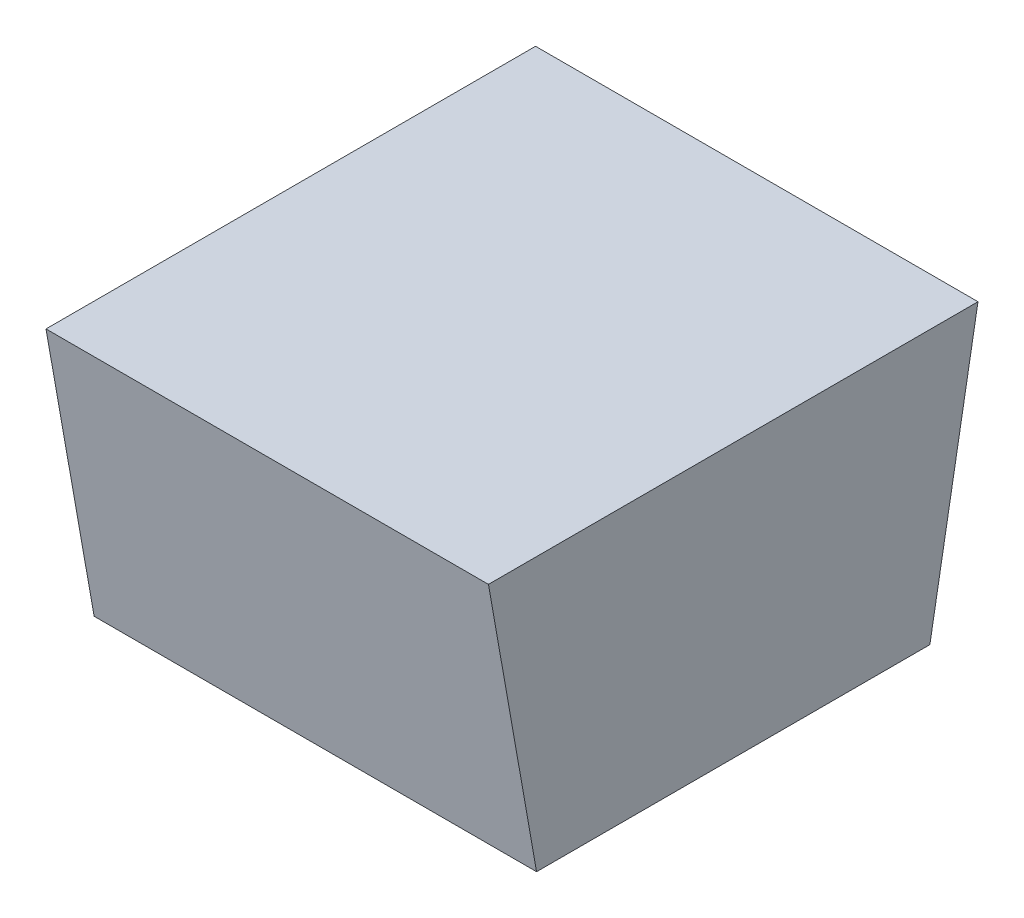
ISO-10303-21;
HEADER;
FILE_DESCRIPTION(('STEP AP214'),'2;1');
FILE_NAME('part.step','',(''),(''),'','','');
FILE_SCHEMA(('AUTOMOTIVE_DESIGN { 1 0 10303 214 1 1 1 1 }'));
ENDSEC;
DATA;
#1=APPLICATION_CONTEXT('core data for automotive mechanical design processes');
#2=APPLICATION_PROTOCOL_DEFINITION('international standard','automotive_design',2000,#1);
#3=PRODUCT_CONTEXT('',#1,'mechanical');
#4=PRODUCT('Part','Part','',(#3));
#5=PRODUCT_RELATED_PRODUCT_CATEGORY('part','',(#4));
#6=PRODUCT_DEFINITION_FORMATION('','',#4);
#7=PRODUCT_DEFINITION_CONTEXT('part definition',#1,'design');
#8=PRODUCT_DEFINITION('design','',#6,#7);
#9=PRODUCT_DEFINITION_SHAPE('','',#8);
#10=(LENGTH_UNIT() NAMED_UNIT(*) SI_UNIT(.MILLI.,.METRE.));
#11=(NAMED_UNIT(*) PLANE_ANGLE_UNIT() SI_UNIT($,.RADIAN.));
#12=(NAMED_UNIT(*) SI_UNIT($,.STERADIAN.) SOLID_ANGLE_UNIT());
#13=UNCERTAINTY_MEASURE_WITH_UNIT(LENGTH_MEASURE(1.E-05),#10,'distance_accuracy_value','');
#14=(GEOMETRIC_REPRESENTATION_CONTEXT(3) GLOBAL_UNCERTAINTY_ASSIGNED_CONTEXT((#13)) GLOBAL_UNIT_ASSIGNED_CONTEXT((#10,
#11,#12)) REPRESENTATION_CONTEXT('',''));
#15=CARTESIAN_POINT('',(0.,0.,0.));
#16=DIRECTION('',(0.,0.,1.));
#17=DIRECTION('',(1.,0.,0.));
#18=AXIS2_PLACEMENT_3D('',#15,#16,#17);
#19=CARTESIAN_POINT('',(0.,0.277595628415304,0.));
#20=DIRECTION('',(0.,1.,0.));
#21=DIRECTION('',(0.,0.,1.));
#22=AXIS2_PLACEMENT_3D('',#19,#20,#21);
#23=PLANE('',#22);
#24=DIRECTION('',(0.,0.,-1.));
#25=VECTOR('',#24,1.);
#26=CARTESIAN_POINT('',(-0.225000058,0.277595628415304,1.007000018));
#27=LINE('',#26,#25);
#28=CARTESIAN_POINT('',(-0.225000058,0.277595628415304,0.24894758001634));
#29=VERTEX_POINT('',#28);
#30=CARTESIAN_POINT('',(-0.225000058,0.277595628415304,-0.24894758001634));
#31=VERTEX_POINT('',#30);
#32=EDGE_CURVE('E92',#29,#31,#27,.T.);
#33=ORIENTED_EDGE('',*,*,#32,.F.);
#34=DIRECTION('',(-1.,0.,0.));
#35=VECTOR('',#34,1.);
#36=CARTESIAN_POINT('',(1.007000018,0.277595628415304,0.24894758001634));
#37=LINE('',#36,#35);
#38=CARTESIAN_POINT('',(0.225000058,0.277595628415304,0.24894758001634));
#39=VERTEX_POINT('',#38);
#40=EDGE_CURVE('E57',#39,#29,#37,.T.);
#41=ORIENTED_EDGE('',*,*,#40,.F.);
#42=DIRECTION('',(0.,0.,1.));
#43=VECTOR('',#42,1.);
#44=CARTESIAN_POINT('',(0.225000058,0.277595628415304,1.007000018));
#45=LINE('',#44,#43);
#46=CARTESIAN_POINT('',(0.225000058,0.277595628415304,-0.24894758001634));
#47=VERTEX_POINT('',#46);
#48=EDGE_CURVE('E12',#47,#39,#45,.T.);
#49=ORIENTED_EDGE('',*,*,#48,.F.);
#50=DIRECTION('',(1.,0.,0.));
#51=VECTOR('',#50,1.);
#52=CARTESIAN_POINT('',(1.007000018,0.277595628415304,-0.24894758001634));
#53=LINE('',#52,#51);
#54=EDGE_CURVE('E81',#31,#47,#53,.T.);
#55=ORIENTED_EDGE('',*,*,#54,.F.);
#56=EDGE_LOOP('',(#33,#41,#49,#55));
#57=FACE_BOUND('',#56,.T.);
#58=ADVANCED_FACE('F42',(#57),#23,.T.);
#59=CARTESIAN_POINT('',(1.007000018,0.,-0.199999981));
#60=DIRECTION('',(0.,-0.173648177666931,-0.984807753012208));
#61=DIRECTION('',(0.,0.984807753012208,-0.173648177666931));
#62=AXIS2_PLACEMENT_3D('',#59,#60,#61);
#63=PLANE('',#62);
#64=DIRECTION('',(0.,0.984807753012208,-0.173648177666931));
#65=VECTOR('',#64,1.);
#66=CARTESIAN_POINT('',(-0.225000058,0.,-0.199999981));
#67=LINE('',#66,#65);
#68=CARTESIAN_POINT('',(-0.225000058,0.,-0.199999981));
#69=VERTEX_POINT('',#68);
#70=EDGE_CURVE('E91',#69,#31,#67,.T.);
#71=ORIENTED_EDGE('',*,*,#70,.T.);
#72=ORIENTED_EDGE('',*,*,#54,.T.);
#73=DIRECTION('',(0.,-0.984807753012208,0.173648177666931));
#74=VECTOR('',#73,1.);
#75=CARTESIAN_POINT('',(0.225000058,0.,-0.199999981));
#76=LINE('',#75,#74);
#77=CARTESIAN_POINT('',(0.225000058,0.,-0.199999981));
#78=VERTEX_POINT('',#77);
#79=EDGE_CURVE('E88',#47,#78,#76,.T.);
#80=ORIENTED_EDGE('',*,*,#79,.T.);
#81=DIRECTION('',(-1.,0.,0.));
#82=VECTOR('',#81,1.);
#83=CARTESIAN_POINT('',(1.007000018,0.,-0.199999981));
#84=LINE('',#83,#82);
#85=EDGE_CURVE('E107',#78,#69,#84,.T.);
#86=ORIENTED_EDGE('',*,*,#85,.T.);
#87=EDGE_LOOP('',(#71,#72,#80,#86));
#88=FACE_BOUND('',#87,.T.);
#89=ADVANCED_FACE('F87',(#88),#63,.T.);
#90=CARTESIAN_POINT('',(1.007000018,0.,0.199999981));
#91=DIRECTION('',(0.,-0.173648177666931,0.984807753012208));
#92=DIRECTION('',(0.,-0.984807753012208,-0.173648177666931));
#93=AXIS2_PLACEMENT_3D('',#90,#91,#92);
#94=PLANE('',#93);
#95=DIRECTION('',(0.,0.984807753012208,0.173648177666931));
#96=VECTOR('',#95,1.);
#97=CARTESIAN_POINT('',(0.225000058,0.,0.199999981));
#98=LINE('',#97,#96);
#99=CARTESIAN_POINT('',(0.225000058,0.,0.199999981));
#100=VERTEX_POINT('',#99);
#101=EDGE_CURVE('E98',#100,#39,#98,.T.);
#102=ORIENTED_EDGE('',*,*,#101,.T.);
#103=ORIENTED_EDGE('',*,*,#40,.T.);
#104=DIRECTION('',(0.,-0.984807753012208,-0.173648177666931));
#105=VECTOR('',#104,1.);
#106=CARTESIAN_POINT('',(-0.225000058,0.,0.199999981));
#107=LINE('',#106,#105);
#108=CARTESIAN_POINT('',(-0.225000058,0.,0.199999981));
#109=VERTEX_POINT('',#108);
#110=EDGE_CURVE('E109',#29,#109,#107,.T.);
#111=ORIENTED_EDGE('',*,*,#110,.T.);
#112=DIRECTION('',(-1.,0.,0.));
#113=VECTOR('',#112,1.);
#114=CARTESIAN_POINT('',(1.007000018,0.,0.199999981));
#115=LINE('',#114,#113);
#116=EDGE_CURVE('E64',#100,#109,#115,.T.);
#117=ORIENTED_EDGE('',*,*,#116,.F.);
#118=EDGE_LOOP('',(#102,#103,#111,#117));
#119=FACE_BOUND('',#118,.T.);
#120=ADVANCED_FACE('F116',(#119),#94,.T.);
#121=CARTESIAN_POINT('',(-0.225000058,0.980000072,1.007000018));
#122=DIRECTION('',(-1.,0.,0.));
#123=DIRECTION('',(0.,-1.,0.));
#124=AXIS2_PLACEMENT_3D('',#121,#122,#123);
#125=PLANE('',#124);
#126=ORIENTED_EDGE('',*,*,#110,.F.);
#127=ORIENTED_EDGE('',*,*,#32,.T.);
#128=ORIENTED_EDGE('',*,*,#70,.F.);
#129=DIRECTION('',(0.,0.,-1.));
#130=VECTOR('',#129,1.);
#131=CARTESIAN_POINT('',(-0.225000058,0.,0.199999981));
#132=LINE('',#131,#130);
#133=EDGE_CURVE('E97',#109,#69,#132,.T.);
#134=ORIENTED_EDGE('',*,*,#133,.F.);
#135=EDGE_LOOP('',(#126,#127,#128,#134));
#136=FACE_BOUND('',#135,.T.);
#137=ADVANCED_FACE('F114',(#136),#125,.T.);
#138=CARTESIAN_POINT('',(0.225000058,-0.00999998,1.007000018));
#139=DIRECTION('',(1.,0.,0.));
#140=DIRECTION('',(0.,1.,0.));
#141=AXIS2_PLACEMENT_3D('',#138,#139,#140);
#142=PLANE('',#141);
#143=ORIENTED_EDGE('',*,*,#79,.F.);
#144=ORIENTED_EDGE('',*,*,#48,.T.);
#145=ORIENTED_EDGE('',*,*,#101,.F.);
#146=DIRECTION('',(0.,0.,1.));
#147=VECTOR('',#146,1.);
#148=CARTESIAN_POINT('',(0.225000058,0.,0.199999981));
#149=LINE('',#148,#147);
#150=EDGE_CURVE('E50',#78,#100,#149,.T.);
#151=ORIENTED_EDGE('',*,*,#150,.F.);
#152=EDGE_LOOP('',(#143,#144,#145,#151));
#153=FACE_BOUND('',#152,.T.);
#154=ADVANCED_FACE('F94',(#153),#142,.T.);
#155=CARTESIAN_POINT('',(0.,0.,0.));
#156=DIRECTION('',(0.,1.,0.));
#157=DIRECTION('',(0.,0.,1.));
#158=AXIS2_PLACEMENT_3D('',#155,#156,#157);
#159=PLANE('',#158);
#160=ORIENTED_EDGE('',*,*,#133,.T.);
#161=ORIENTED_EDGE('',*,*,#85,.F.);
#162=ORIENTED_EDGE('',*,*,#150,.T.);
#163=ORIENTED_EDGE('',*,*,#116,.T.);
#164=EDGE_LOOP('',(#160,#161,#162,#163));
#165=FACE_BOUND('',#164,.T.);
#166=ADVANCED_FACE('F44',(#165),#159,.F.);
#167=CLOSED_SHELL('',(#58,#89,#120,#137,#154,#166));
#168=MANIFOLD_SOLID_BREP('B2',#167);
#169=ADVANCED_BREP_SHAPE_REPRESENTATION('',(#18,#168),#14);
#170=SHAPE_DEFINITION_REPRESENTATION(#9,#169);
ENDSEC;
END-ISO-10303-21;
